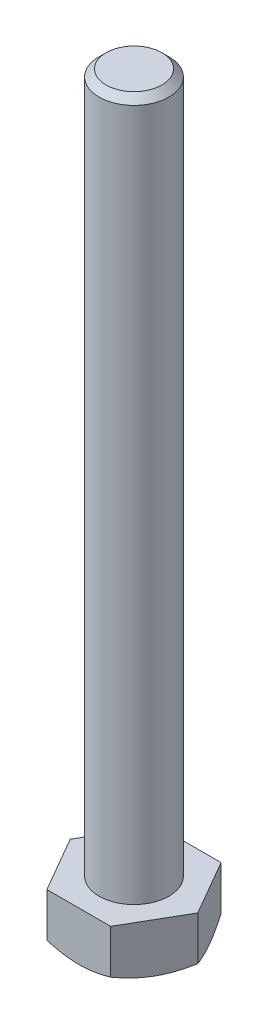
ISO-10303-21;
HEADER;
FILE_DESCRIPTION(('STEP AP214'),'2;1');
FILE_NAME('part.step','',(''),(''),'','','');
FILE_SCHEMA(('AUTOMOTIVE_DESIGN { 1 0 10303 214 1 1 1 1 }'));
ENDSEC;
DATA;
#1=APPLICATION_CONTEXT('core data for automotive mechanical design processes');
#2=APPLICATION_PROTOCOL_DEFINITION('international standard','automotive_design',2000,#1);
#3=PRODUCT_CONTEXT('',#1,'mechanical');
#4=PRODUCT('Part','Part','',(#3));
#5=PRODUCT_RELATED_PRODUCT_CATEGORY('part','',(#4));
#6=PRODUCT_DEFINITION_FORMATION('','',#4);
#7=PRODUCT_DEFINITION_CONTEXT('part definition',#1,'design');
#8=PRODUCT_DEFINITION('design','',#6,#7);
#9=PRODUCT_DEFINITION_SHAPE('','',#8);
#10=(LENGTH_UNIT() NAMED_UNIT(*) SI_UNIT(.MILLI.,.METRE.));
#11=(NAMED_UNIT(*) PLANE_ANGLE_UNIT() SI_UNIT($,.RADIAN.));
#12=(NAMED_UNIT(*) SI_UNIT($,.STERADIAN.) SOLID_ANGLE_UNIT());
#13=UNCERTAINTY_MEASURE_WITH_UNIT(LENGTH_MEASURE(1.E-05),#10,'distance_accuracy_value','');
#14=(GEOMETRIC_REPRESENTATION_CONTEXT(3) GLOBAL_UNCERTAINTY_ASSIGNED_CONTEXT((#13)) GLOBAL_UNIT_ASSIGNED_CONTEXT((#10,
#11,#12)) REPRESENTATION_CONTEXT('',''));
#15=CARTESIAN_POINT('',(0.,0.,0.));
#16=DIRECTION('',(0.,0.,1.));
#17=DIRECTION('',(1.,0.,0.));
#18=AXIS2_PLACEMENT_3D('',#15,#16,#17);
#19=CARTESIAN_POINT('',(2.28053356329902,53.5,3.95));
#20=DIRECTION('',(-0.866025403784439,0.,-0.5));
#21=DIRECTION('',(-0.5,0.,0.866025403784439));
#22=AXIS2_PLACEMENT_3D('',#19,#20,#21);
#23=PLANE('',#22);
#24=DIRECTION('',(0.,-1.,0.));
#25=VECTOR('',#24,1.);
#26=CARTESIAN_POINT('',(2.28053356329902,53.5,3.95));
#27=LINE('',#26,#25);
#28=CARTESIAN_POINT('',(2.28053356329902,3.5,3.95));
#29=VERTEX_POINT('',#28);
#30=CARTESIAN_POINT('',(2.28053356329902,0.352799770034311,3.95));
#31=VERTEX_POINT('',#30);
#32=EDGE_CURVE('E196',#29,#31,#27,.T.);
#33=ORIENTED_EDGE('',*,*,#32,.T.);
#34=CARTESIAN_POINT('',(2.28041809324518,0.352866439232559,3.9502));
#35=CARTESIAN_POINT('',(2.38063568061467,0.29498466517833,3.77661804686408));
#36=CARTESIAN_POINT('',(2.48171834047415,0.242343384693469,3.60153774422325));
#37=CARTESIAN_POINT('',(2.68563399767937,0.15045769122082,3.24834546548501));
#38=CARTESIAN_POINT('',(2.78847061820894,0.111245783680884,3.07022721384912));
#39=CARTESIAN_POINT('',(2.99286939806646,0.0502069964662325,2.71619814213081));
#40=CARTESIAN_POINT('',(3.09440010889697,0.0279738669923628,2.54034179244378));
#41=CARTESIAN_POINT('',(3.2979392458968,0.00143257410152678,2.18780166583136));
#42=CARTESIAN_POINT('',(3.39994693229981,-0.0028975682651904,2.01111917021878));
#43=CARTESIAN_POINT('',(3.59055257085472,0.0061125958312302,1.68098052003257));
#44=CARTESIAN_POINT('',(3.67917906182971,0.0172406019947407,1.52747493476735));
#45=CARTESIAN_POINT('',(3.85585464520722,0.0525092384080949,1.22146384790063));
#46=CARTESIAN_POINT('',(3.94390312656325,0.0766619154689032,1.06895940466271));
#47=CARTESIAN_POINT('',(4.1209429556258,0.137041499215026,0.762317425763064));
#48=CARTESIAN_POINT('',(4.20991189711042,0.173524342732937,0.60821869881607));
#49=CARTESIAN_POINT('',(4.386522859466,0.256325958671651,0.302319538842572));
#50=CARTESIAN_POINT('',(4.47416714283355,0.302625276645222,0.150515187057013));
#51=CARTESIAN_POINT('',(4.56118259665188,0.35286643923256,-0.000199999999999486));
#52=B_SPLINE_CURVE_WITH_KNOTS('',3,(#34,#35,#36,#37,#38,#39,#40,#41,#42,#43,#44,#45,#46,#47,#48,
#49,#50,#51),.UNSPECIFIED.,.F.,.F.,(4,2,2,2,2,2,2,2,4),(0.,0.626122435414088,1.25374984683404,
1.86584388199859,2.47718624449848,3.00948555938868,3.54227805643855,4.08688849089222,
4.63042953105667),.UNSPECIFIED.);
#53=CARTESIAN_POINT('',(3.42080034494853,0.,1.975));
#54=VERTEX_POINT('',#53);
#55=EDGE_CURVE('E56',#31,#54,#52,.T.);
#56=ORIENTED_EDGE('',*,*,#55,.T.);
#57=CARTESIAN_POINT('',(4.56106712659804,0.352799770034312,0.));
#58=VERTEX_POINT('',#57);
#59=EDGE_CURVE('E177',#54,#58,#52,.T.);
#60=ORIENTED_EDGE('',*,*,#59,.T.);
#61=DIRECTION('',(0.,-1.,0.));
#62=VECTOR('',#61,1.);
#63=CARTESIAN_POINT('',(4.56106712659804,53.5,0.));
#64=LINE('',#63,#62);
#65=CARTESIAN_POINT('',(4.56106712659804,3.5,0.));
#66=VERTEX_POINT('',#65);
#67=EDGE_CURVE('E208',#66,#58,#64,.T.);
#68=ORIENTED_EDGE('',*,*,#67,.F.);
#69=DIRECTION('',(0.5,0.,-0.866025403784439));
#70=VECTOR('',#69,1.);
#71=CARTESIAN_POINT('',(2.28053356329902,3.5,3.95));
#72=LINE('',#71,#70);
#73=EDGE_CURVE('E194',#29,#66,#72,.T.);
#74=ORIENTED_EDGE('',*,*,#73,.F.);
#75=EDGE_LOOP('',(#33,#56,#60,#68,#74));
#76=FACE_BOUND('',#75,.T.);
#77=ADVANCED_FACE('F34',(#76),#23,.F.);
#78=CARTESIAN_POINT('',(4.56106712659804,53.5,0.));
#79=DIRECTION('',(-0.866025403784438,0.,0.5));
#80=DIRECTION('',(0.5,0.,0.866025403784439));
#81=AXIS2_PLACEMENT_3D('',#78,#79,#80);
#82=PLANE('',#81);
#83=ORIENTED_EDGE('',*,*,#67,.T.);
#84=CARTESIAN_POINT('',(4.56118259665188,0.35286643923256,0.000200000000000792));
#85=CARTESIAN_POINT('',(4.4609650092824,0.294984665178331,-0.173381953135922));
#86=CARTESIAN_POINT('',(4.35988234942291,0.24234338469347,-0.348462255776748));
#87=CARTESIAN_POINT('',(4.15596669221769,0.150457691220819,-0.701654534514986));
#88=CARTESIAN_POINT('',(4.05313007168813,0.111245783680884,-0.879772786150876));
#89=CARTESIAN_POINT('',(3.84873129183061,0.0502069964662322,-1.23380185786919));
#90=CARTESIAN_POINT('',(3.74720058100009,0.0279738669923626,-1.40965820755622));
#91=CARTESIAN_POINT('',(3.54366144400027,0.00143257410152646,-1.76219833416864));
#92=CARTESIAN_POINT('',(3.44165375759725,-0.002897568265191,-1.93888082978122));
#93=CARTESIAN_POINT('',(3.25104811904234,0.00611259583122921,-2.26901947996743));
#94=CARTESIAN_POINT('',(3.16242162806736,0.0172406019947396,-2.42252506523265));
#95=CARTESIAN_POINT('',(2.98574604468985,0.0525092384080937,-2.72853615209937));
#96=CARTESIAN_POINT('',(2.89769756333382,0.0766619154689019,-2.88104059533729));
#97=CARTESIAN_POINT('',(2.72065773427127,0.137041499215025,-3.18768257423694));
#98=CARTESIAN_POINT('',(2.63168879278664,0.173524342732935,-3.34178130118393));
#99=CARTESIAN_POINT('',(2.45507783043106,0.25632595867165,-3.64768046115743));
#100=CARTESIAN_POINT('',(2.36743354706351,0.302625276645221,-3.79948481294299));
#101=CARTESIAN_POINT('',(2.28041809324518,0.352866439232559,-3.9502));
#102=B_SPLINE_CURVE_WITH_KNOTS('',3,(#84,#85,#86,#87,#88,#89,#90,#91,#92,#93,#94,#95,#96,#97,
#98,#99,#100,#101),.UNSPECIFIED.,.F.,.F.,(4,2,2,2,2,2,2,2,4),(0.,0.626122435414089,
1.25374984683404,1.86584388199859,2.47718624449848,3.00948555938868,3.54227805643855,
4.08688849089222,4.63042953105668),.UNSPECIFIED.);
#103=CARTESIAN_POINT('',(3.42080034494853,0.,-1.975));
#104=VERTEX_POINT('',#103);
#105=EDGE_CURVE('E143',#58,#104,#102,.T.);
#106=ORIENTED_EDGE('',*,*,#105,.T.);
#107=CARTESIAN_POINT('',(2.28053356329902,0.352799770034311,-3.95));
#108=VERTEX_POINT('',#107);
#109=EDGE_CURVE('E125',#104,#108,#102,.T.);
#110=ORIENTED_EDGE('',*,*,#109,.T.);
#111=DIRECTION('',(0.,-1.,0.));
#112=VECTOR('',#111,1.);
#113=CARTESIAN_POINT('',(2.28053356329902,53.5,-3.95));
#114=LINE('',#113,#112);
#115=CARTESIAN_POINT('',(2.28053356329902,3.5,-3.95));
#116=VERTEX_POINT('',#115);
#117=EDGE_CURVE('E142',#116,#108,#114,.T.);
#118=ORIENTED_EDGE('',*,*,#117,.F.);
#119=DIRECTION('',(-0.5,0.,-0.866025403784439));
#120=VECTOR('',#119,1.);
#121=CARTESIAN_POINT('',(4.56106712659804,3.5,0.));
#122=LINE('',#121,#120);
#123=EDGE_CURVE('E192',#66,#116,#122,.T.);
#124=ORIENTED_EDGE('',*,*,#123,.F.);
#125=EDGE_LOOP('',(#83,#106,#110,#118,#124));
#126=FACE_BOUND('',#125,.T.);
#127=ADVANCED_FACE('F168',(#126),#82,.F.);
#128=CARTESIAN_POINT('',(2.28053356329902,53.5,-3.95));
#129=DIRECTION('',(0.,0.,1.));
#130=DIRECTION('',(1.,0.,0.));
#131=AXIS2_PLACEMENT_3D('',#128,#129,#130);
#132=PLANE('',#131);
#133=ORIENTED_EDGE('',*,*,#117,.T.);
#134=CARTESIAN_POINT('',(-6.10357758199648,1.91693231106891,-3.95));
#135=CARTESIAN_POINT('',(-5.93124296341037,1.83342413986499,-3.95));
#136=CARTESIAN_POINT('',(-5.75851034716177,1.7507231237423,-3.95));
#137=CARTESIAN_POINT('',(-5.41203738808505,1.58738980517233,-3.95));
#138=CARTESIAN_POINT('',(-5.23829688964106,1.50675783320087,-3.95));
#139=CARTESIAN_POINT('',(-4.88869053692414,1.34760657001449,-3.95));
#140=CARTESIAN_POINT('',(-4.71281824674957,1.26910136723712,-3.95));
#141=CARTESIAN_POINT('',(-4.35966706590354,1.11533340183023,-3.95));
#142=CARTESIAN_POINT('',(-4.18238824282438,1.04007048449381,-3.95));
#143=CARTESIAN_POINT('',(-3.82050032721837,0.89132492021823,-3.95));
#144=CARTESIAN_POINT('',(-3.63583679895024,0.817973982970938,-3.95));
#145=CARTESIAN_POINT('',(-3.26434104766608,0.676877601703548,-3.95));
#146=CARTESIAN_POINT('',(-3.07750858274522,0.60913278992708,-3.95));
#147=CARTESIAN_POINT('',(-2.70173475211593,0.481043410509852,-3.95));
#148=CARTESIAN_POINT('',(-2.51279861234366,0.420683666781782,-3.95));
#149=CARTESIAN_POINT('',(-2.13221628603157,0.309315998631552,-3.95));
#150=CARTESIAN_POINT('',(-1.9405709808664,0.258305104875555,-3.95));
#151=CARTESIAN_POINT('',(-1.55552434463117,0.168368778188127,-3.95));
#152=CARTESIAN_POINT('',(-1.36213845471526,0.129378460835559,-3.95));
#153=CARTESIAN_POINT('',(-0.972985101602572,0.0657013823696122,-3.95));
#154=CARTESIAN_POINT('',(-0.777217857929892,0.0410133128601275,-3.95));
#155=CARTESIAN_POINT('',(-0.386827068328998,0.00823383358748254,-3.95));
#156=CARTESIAN_POINT('',(-0.192221734876161,-6.91438180813361E-05,-3.95));
#157=CARTESIAN_POINT('',(0.196997929016572,6.99774314488553E-05,-3.95));
#158=CARTESIAN_POINT('',(0.391612259559857,0.00851243380211182,-3.95));
#159=CARTESIAN_POINT('',(0.722677109724479,0.0365237749212534,-3.95));
#160=CARTESIAN_POINT('',(0.859484148618515,0.0521141661874182,-3.95));
#161=CARTESIAN_POINT('',(1.13207609093672,0.0905871323117199,-3.95));
#162=CARTESIAN_POINT('',(1.26786085001275,0.113470717925195,-3.95));
#163=CARTESIAN_POINT('',(1.67351297163642,0.191856311837088,-3.95));
#164=CARTESIAN_POINT('',(1.94152194628906,0.257078202966896,-3.95));
#165=CARTESIAN_POINT('',(2.34222812581931,0.369908571745236,-3.95));
#166=CARTESIAN_POINT('',(2.47700932246483,0.410535217395792,-3.95));
#167=CARTESIAN_POINT('',(2.74526197374985,0.49594181803233,-3.95));
#168=CARTESIAN_POINT('',(2.87873341992142,0.540721799851382,-3.95));
#169=CARTESIAN_POINT('',(3.1444100594592,0.633722017418443,-3.95));
#170=CARTESIAN_POINT('',(3.27661566965515,0.68194107318557,-3.95));
#171=CARTESIAN_POINT('',(3.53993613663676,0.781258796495595,-3.95));
#172=CARTESIAN_POINT('',(3.67105100463013,0.83235743440785,-3.95));
#173=CARTESIAN_POINT('',(3.97386714290639,0.95359226728304,-3.95));
#174=CARTESIAN_POINT('',(4.1452130929492,1.02461418324626,-3.95));
#175=CARTESIAN_POINT('',(4.48649853133974,1.16996930194956,-3.95));
#176=CARTESIAN_POINT('',(4.65643794353951,1.2443026825951,-3.95));
#177=CARTESIAN_POINT('',(4.99516077724692,1.3956337735108,-3.95));
#178=CARTESIAN_POINT('',(5.16394398064623,1.47263197074913,-3.95));
#179=CARTESIAN_POINT('',(5.50051447925895,1.62877818362153,-3.95));
#180=CARTESIAN_POINT('',(5.66830175446394,1.70792624226988,-3.95));
#181=CARTESIAN_POINT('',(6.17072112904776,1.94813182359853,-3.95));
#182=CARTESIAN_POINT('',(6.50409969730983,2.11180990992146,-3.95));
#183=CARTESIAN_POINT('',(7.16846869153804,2.44394123801235,-3.95));
#184=CARTESIAN_POINT('',(7.49945903325812,2.61239464720944,-3.95));
#185=CARTESIAN_POINT('',(8.13304098864775,2.93898775889549,-3.95));
#186=CARTESIAN_POINT('',(8.4357691875192,3.09686298206285,-3.95));
#187=CARTESIAN_POINT('',(9.04008916358199,3.41479351154543,-3.95));
#188=CARTESIAN_POINT('',(9.34168090395802,3.57484888772418,-3.95));
#189=CARTESIAN_POINT('',(9.9432653473041,3.8962513165353,-3.95));
#190=CARTESIAN_POINT('',(10.243260141572,4.05759445986514,-3.95));
#191=CARTESIAN_POINT('',(10.8425188719185,4.38159580299575,-3.95));
#192=CARTESIAN_POINT('',(11.1417828452411,4.5442539338812,-3.95));
#193=CARTESIAN_POINT('',(11.4407759086026,4.70740493554459,-3.95));
#194=B_SPLINE_CURVE_WITH_KNOTS('',3,(#134,#135,#136,#137,#138,#139,#140,#141,#142,#143,#144,
#145,#146,#147,#148,#149,#150,#151,#152,#153,#154,#155,#156,#157,#158,#159,#160,#161,#162,#163,
#164,#165,#166,#167,#168,#169,#170,#171,#172,#173,#174,#175,#176,#177,#178,#179,#180,#181,#182,
#183,#184,#185,#186,#187,#188,#189,#190,#191,#192,#193),.UNSPECIFIED.,.F.,.F.,(4,2,2,2,2,2,2,2,
2,2,2,2,2,2,2,2,2,2,2,2,2,2,2,2,2,2,2,2,2,4),(0.,0.574511714877499,1.14911462891598,
1.72688352304033,2.3046248180952,2.90064911574734,3.49674054005759,4.09158567320565,
4.68624154602117,5.27762900624728,5.86896235670716,6.45260899073125,7.03626809273551,
7.44914484842698,7.86207884912884,8.68841555975474,9.11069388963043,9.53297494787033,
9.95511180785677,10.3772443248853,10.9336439344889,11.4900734722945,12.0466052344872,
12.6031481399434,13.7172581519158,14.8314072744837,15.8556614473226,16.8799485202109,
17.9018335532885,18.9236653746146),.UNSPECIFIED.);
#195=CARTESIAN_POINT('',(0.,0.,-3.95));
#196=VERTEX_POINT('',#195);
#197=EDGE_CURVE('E118',#108,#196,#194,.F.);
#198=ORIENTED_EDGE('',*,*,#197,.T.);
#199=CARTESIAN_POINT('',(-2.28053356329902,0.352799770034311,-3.95));
#200=VERTEX_POINT('',#199);
#201=EDGE_CURVE('E106',#196,#200,#194,.F.);
#202=ORIENTED_EDGE('',*,*,#201,.T.);
#203=DIRECTION('',(0.,-1.,0.));
#204=VECTOR('',#203,1.);
#205=CARTESIAN_POINT('',(-2.28053356329902,53.5,-3.95));
#206=LINE('',#205,#204);
#207=CARTESIAN_POINT('',(-2.28053356329902,3.5,-3.95));
#208=VERTEX_POINT('',#207);
#209=EDGE_CURVE('E205',#208,#200,#206,.T.);
#210=ORIENTED_EDGE('',*,*,#209,.F.);
#211=DIRECTION('',(-1.,0.,0.));
#212=VECTOR('',#211,1.);
#213=CARTESIAN_POINT('',(2.28053356329902,3.5,-3.95));
#214=LINE('',#213,#212);
#215=EDGE_CURVE('E190',#116,#208,#214,.T.);
#216=ORIENTED_EDGE('',*,*,#215,.F.);
#217=EDGE_LOOP('',(#133,#198,#202,#210,#216));
#218=FACE_BOUND('',#217,.T.);
#219=ADVANCED_FACE('F139',(#218),#132,.F.);
#220=CARTESIAN_POINT('',(-2.28053356329902,53.5,-3.95));
#221=DIRECTION('',(0.866025403784439,0.,0.5));
#222=DIRECTION('',(0.5,0.,-0.866025403784439));
#223=AXIS2_PLACEMENT_3D('',#220,#221,#222);
#224=PLANE('',#223);
#225=ORIENTED_EDGE('',*,*,#209,.T.);
#226=CARTESIAN_POINT('',(-2.28041809324518,0.352866439232559,-3.9502));
#227=CARTESIAN_POINT('',(-2.38063568061467,0.29498466517833,-3.77661804686408));
#228=CARTESIAN_POINT('',(-2.48171834047415,0.242343384693469,-3.60153774422325));
#229=CARTESIAN_POINT('',(-2.68563399767937,0.15045769122082,-3.24834546548501));
#230=CARTESIAN_POINT('',(-2.78847061820894,0.111245783680884,-3.07022721384912));
#231=CARTESIAN_POINT('',(-2.99286939806646,0.0502069964662324,-2.71619814213081));
#232=CARTESIAN_POINT('',(-3.09440010889697,0.0279738669923625,-2.54034179244378));
#233=CARTESIAN_POINT('',(-3.29793924589679,0.00143257410152648,-2.18780166583136));
#234=CARTESIAN_POINT('',(-3.39994693229981,-0.00289756826519048,-2.01111917021878));
#235=CARTESIAN_POINT('',(-3.59055257085472,0.00611259583122976,-1.68098052003257));
#236=CARTESIAN_POINT('',(-3.67917906182971,0.0172406019947398,-1.52747493476735));
#237=CARTESIAN_POINT('',(-3.85585464520722,0.0525092384080938,-1.22146384790063));
#238=CARTESIAN_POINT('',(-3.94390312656325,0.0766619154689024,-1.06895940466271));
#239=CARTESIAN_POINT('',(-4.1209429556258,0.137041499215026,-0.762317425763064));
#240=CARTESIAN_POINT('',(-4.20991189711042,0.173524342732936,-0.60821869881607));
#241=CARTESIAN_POINT('',(-4.386522859466,0.256325958671651,-0.302319538842571));
#242=CARTESIAN_POINT('',(-4.47416714283355,0.302625276645221,-0.150515187057012));
#243=CARTESIAN_POINT('',(-4.56118259665188,0.352866439232559,0.000200000000000661));
#244=B_SPLINE_CURVE_WITH_KNOTS('',3,(#226,#227,#228,#229,#230,#231,#232,#233,#234,#235,#236,
#237,#238,#239,#240,#241,#242,#243),.UNSPECIFIED.,.F.,.F.,(4,2,2,2,2,2,2,2,4),(0.,
0.626122435414089,1.25374984683404,1.86584388199859,2.47718624449848,3.00948555938868,
3.54227805643855,4.08688849089222,4.63042953105668),.UNSPECIFIED.);
#245=CARTESIAN_POINT('',(-3.42080034494853,0.,-1.975));
#246=VERTEX_POINT('',#245);
#247=EDGE_CURVE('E113',#200,#246,#244,.T.);
#248=ORIENTED_EDGE('',*,*,#247,.T.);
#249=CARTESIAN_POINT('',(-4.56106712659804,0.352799770034311,0.));
#250=VERTEX_POINT('',#249);
#251=EDGE_CURVE('E151',#246,#250,#244,.T.);
#252=ORIENTED_EDGE('',*,*,#251,.T.);
#253=DIRECTION('',(0.,-1.,0.));
#254=VECTOR('',#253,1.);
#255=CARTESIAN_POINT('',(-4.56106712659804,53.5,0.));
#256=LINE('',#255,#254);
#257=CARTESIAN_POINT('',(-4.56106712659804,3.5,0.));
#258=VERTEX_POINT('',#257);
#259=EDGE_CURVE('E202',#258,#250,#256,.T.);
#260=ORIENTED_EDGE('',*,*,#259,.F.);
#261=DIRECTION('',(-0.5,0.,0.866025403784439));
#262=VECTOR('',#261,1.);
#263=CARTESIAN_POINT('',(-2.28053356329902,3.5,-3.95));
#264=LINE('',#263,#262);
#265=EDGE_CURVE('E188',#208,#258,#264,.T.);
#266=ORIENTED_EDGE('',*,*,#265,.F.);
#267=EDGE_LOOP('',(#225,#248,#252,#260,#266));
#268=FACE_BOUND('',#267,.T.);
#269=ADVANCED_FACE('F167',(#268),#224,.F.);
#270=CARTESIAN_POINT('',(-4.56106712659804,53.5,0.));
#271=DIRECTION('',(0.866025403784439,0.,-0.5));
#272=DIRECTION('',(-0.5,0.,-0.866025403784439));
#273=AXIS2_PLACEMENT_3D('',#270,#271,#272);
#274=PLANE('',#273);
#275=ORIENTED_EDGE('',*,*,#259,.T.);
#276=CARTESIAN_POINT('',(-4.56118259665188,0.352866439232559,-0.000199999999999148));
#277=CARTESIAN_POINT('',(-4.4609650092824,0.29498466517833,0.173381953135924));
#278=CARTESIAN_POINT('',(-4.35988234942291,0.242343384693469,0.34846225577675));
#279=CARTESIAN_POINT('',(-4.15596669221769,0.15045769122082,0.701654534514988));
#280=CARTESIAN_POINT('',(-4.05313007168813,0.111245783680884,0.879772786150879));
#281=CARTESIAN_POINT('',(-3.8487312918306,0.0502069964662323,1.23380185786919));
#282=CARTESIAN_POINT('',(-3.74720058100009,0.0279738669923624,1.40965820755622));
#283=CARTESIAN_POINT('',(-3.54366144400027,0.0014325741015265,1.76219833416864));
#284=CARTESIAN_POINT('',(-3.44165375759725,-0.00289756826519031,1.93888082978122));
#285=CARTESIAN_POINT('',(-3.25104811904234,0.00611259583123015,2.26901947996743));
#286=CARTESIAN_POINT('',(-3.16242162806736,0.0172406019947403,2.42252506523265));
#287=CARTESIAN_POINT('',(-2.98574604468985,0.0525092384080944,2.72853615209937));
#288=CARTESIAN_POINT('',(-2.89769756333382,0.0766619154689029,2.8810405953373));
#289=CARTESIAN_POINT('',(-2.72065773427127,0.137041499215026,3.18768257423694));
#290=CARTESIAN_POINT('',(-2.63168879278664,0.173524342732936,3.34178130118393));
#291=CARTESIAN_POINT('',(-2.45507783043106,0.25632595867165,3.64768046115743));
#292=CARTESIAN_POINT('',(-2.36743354706351,0.30262527664522,3.79948481294299));
#293=CARTESIAN_POINT('',(-2.28041809324518,0.352866439232559,3.9502));
#294=B_SPLINE_CURVE_WITH_KNOTS('',3,(#276,#277,#278,#279,#280,#281,#282,#283,#284,#285,#286,
#287,#288,#289,#290,#291,#292,#293),.UNSPECIFIED.,.F.,.F.,(4,2,2,2,2,2,2,2,4),(0.,
0.62612243541409,1.25374984683404,1.86584388199859,2.47718624449848,3.00948555938868,
3.54227805643855,4.08688849089222,4.63042953105667),.UNSPECIFIED.);
#295=CARTESIAN_POINT('',(-3.42080034494853,0.,1.975));
#296=VERTEX_POINT('',#295);
#297=EDGE_CURVE('E220',#250,#296,#294,.T.);
#298=ORIENTED_EDGE('',*,*,#297,.T.);
#299=CARTESIAN_POINT('',(-2.28053356329983,0.352799770033768,3.95));
#300=VERTEX_POINT('',#299);
#301=EDGE_CURVE('E223',#296,#300,#294,.T.);
#302=ORIENTED_EDGE('',*,*,#301,.T.);
#303=DIRECTION('',(0.,-1.,0.));
#304=VECTOR('',#303,1.);
#305=CARTESIAN_POINT('',(-2.28053356329902,53.5,3.95));
#306=LINE('',#305,#304);
#307=CARTESIAN_POINT('',(-2.28053356329902,3.5,3.95));
#308=VERTEX_POINT('',#307);
#309=EDGE_CURVE('E199',#308,#300,#306,.T.);
#310=ORIENTED_EDGE('',*,*,#309,.F.);
#311=DIRECTION('',(0.5,0.,0.866025403784439));
#312=VECTOR('',#311,1.);
#313=CARTESIAN_POINT('',(-4.56106712659804,3.5,0.));
#314=LINE('',#313,#312);
#315=EDGE_CURVE('E186',#258,#308,#314,.T.);
#316=ORIENTED_EDGE('',*,*,#315,.F.);
#317=EDGE_LOOP('',(#275,#298,#302,#310,#316));
#318=FACE_BOUND('',#317,.T.);
#319=ADVANCED_FACE('F221',(#318),#274,.F.);
#320=CARTESIAN_POINT('',(-2.28053356329902,53.5,3.95));
#321=DIRECTION('',(0.,0.,-1.));
#322=DIRECTION('',(-1.,0.,0.));
#323=AXIS2_PLACEMENT_3D('',#320,#321,#322);
#324=PLANE('',#323);
#325=ORIENTED_EDGE('',*,*,#309,.T.);
#326=CARTESIAN_POINT('',(-6.10357758202227,1.91693231108141,3.95));
#327=CARTESIAN_POINT('',(-5.9312429634353,1.83342413987697,3.95));
#328=CARTESIAN_POINT('',(-5.75851034718583,1.75072312375375,3.95));
#329=CARTESIAN_POINT('',(-5.41203738810737,1.58738980518274,3.95));
#330=CARTESIAN_POINT('',(-5.23829688966251,1.50675783321076,3.95));
#331=CARTESIAN_POINT('',(-4.88869053694384,1.34760657002333,3.95));
#332=CARTESIAN_POINT('',(-4.71281824676839,1.26910136724545,3.95));
#333=CARTESIAN_POINT('',(-4.35966706592059,1.11533340183752,3.95));
#334=CARTESIAN_POINT('',(-4.18238824284054,1.04007048450059,3.95));
#335=CARTESIAN_POINT('',(-3.82050032723268,0.891324920223971,3.95));
#336=CARTESIAN_POINT('',(-3.6358367989636,0.817973982976156,3.95));
#337=CARTESIAN_POINT('',(-3.26434104767752,0.676877601707747,3.95));
#338=CARTESIAN_POINT('',(-3.07750858275568,0.609132789930784,3.95));
#339=CARTESIAN_POINT('',(-2.70173475212444,0.481043410512614,3.95));
#340=CARTESIAN_POINT('',(-2.51279861235118,0.420683666784097,3.95));
#341=CARTESIAN_POINT('',(-2.13221628603708,0.309315998633048,3.95));
#342=CARTESIAN_POINT('',(-1.9405709808709,0.258305104876681,3.95));
#343=CARTESIAN_POINT('',(-1.5555243446331,0.168368778188504,3.95));
#344=CARTESIAN_POINT('',(-1.36213845471563,0.12937846083559,3.95));
#345=CARTESIAN_POINT('',(-0.9729851015998,0.0657013823691887,3.95));
#346=CARTESIAN_POINT('',(-0.777217857925527,0.0410133128595953,3.95));
#347=CARTESIAN_POINT('',(-0.386827068321476,0.00823383358701458,3.95));
#348=CARTESIAN_POINT('',(-0.192221734867074,-6.91438183812688E-05,3.95));
#349=CARTESIAN_POINT('',(0.196997929028762,6.99774317547079E-05,3.95));
#350=CARTESIAN_POINT('',(0.391612259573586,0.00851243380285552,3.95));
#351=CARTESIAN_POINT('',(0.722677109740162,0.0365237749228761,3.95));
#352=CARTESIAN_POINT('',(0.859484148634632,0.0521141661893918,3.95));
#353=CARTESIAN_POINT('',(1.13207609095368,0.0905871323144141,3.95));
#354=CARTESIAN_POINT('',(1.26786085003013,0.113470717928259,3.95));
#355=CARTESIAN_POINT('',(1.67351297165502,0.191856311841269,3.95));
#356=CARTESIAN_POINT('',(1.94152194630844,0.257078202971833,3.95));
#357=CARTESIAN_POINT('',(2.34222812583986,0.369908571751288,3.95));
#358=CARTESIAN_POINT('',(2.47700932248578,0.410535217402219,3.95));
#359=CARTESIAN_POINT('',(2.7452619737716,0.495941818039494,3.95));
#360=CARTESIAN_POINT('',(2.87873341994356,0.54072179985891,3.95));
#361=CARTESIAN_POINT('',(3.14441005948213,0.633722017426687,3.95));
#362=CARTESIAN_POINT('',(3.27661566967847,0.681941073194165,3.95));
#363=CARTESIAN_POINT('',(3.53993613666086,0.781258796504881,3.95));
#364=CARTESIAN_POINT('',(3.67105100465462,0.832357434417475,3.95));
#365=CARTESIAN_POINT('',(3.97386714293116,0.953592267293187,3.95));
#366=CARTESIAN_POINT('',(4.14521309297386,1.02461418325657,3.95));
#367=CARTESIAN_POINT('',(4.4864985313642,1.16996930196016,3.95));
#368=CARTESIAN_POINT('',(4.65643794356387,1.24430268260582,3.95));
#369=CARTESIAN_POINT('',(4.9951607772711,1.39563377352175,3.95));
#370=CARTESIAN_POINT('',(5.16394398067032,1.47263197076018,3.95));
#371=CARTESIAN_POINT('',(5.50051447928288,1.62877818363276,3.95));
#372=CARTESIAN_POINT('',(5.6683017544878,1.70792624228118,3.95));
#373=CARTESIAN_POINT('',(6.17072112907139,1.94813182361004,3.95));
#374=CARTESIAN_POINT('',(6.50409969733332,2.11180990993306,3.95));
#375=CARTESIAN_POINT('',(7.16846869156128,2.44394123802411,3.95));
#376=CARTESIAN_POINT('',(7.49945903328123,2.61239464722125,3.95));
#377=CARTESIAN_POINT('',(8.13304098867073,2.93898775890743,3.95));
#378=CARTESIAN_POINT('',(8.43576918754216,3.09686298207485,3.95));
#379=CARTESIAN_POINT('',(9.04008916360492,3.41479351155756,3.95));
#380=CARTESIAN_POINT('',(9.34168090398093,3.57484888773637,3.95));
#381=CARTESIAN_POINT('',(9.94326534732702,3.8962513165476,3.95));
#382=CARTESIAN_POINT('',(10.2432601415949,4.05759445987749,3.95));
#383=CARTESIAN_POINT('',(10.8425188719414,4.38159580300819,3.95));
#384=CARTESIAN_POINT('',(11.141782845264,4.54425393389369,3.94999999999999));
#385=CARTESIAN_POINT('',(11.4407759086256,4.70740493555712,3.95));
#386=B_SPLINE_CURVE_WITH_KNOTS('',3,(#326,#327,#328,#329,#330,#331,#332,#333,#334,#335,#336,
#337,#338,#339,#340,#341,#342,#343,#344,#345,#346,#347,#348,#349,#350,#351,#352,#353,#354,#355,
#356,#357,#358,#359,#360,#361,#362,#363,#364,#365,#366,#367,#368,#369,#370,#371,#372,#373,#374,
#375,#376,#377,#378,#379,#380,#381,#382,#383,#384,#385),.UNSPECIFIED.,.F.,.F.,(4,2,2,2,2,2,2,2,
2,2,2,2,2,2,2,2,2,2,2,2,2,2,2,2,2,2,2,2,2,4),(0.,0.574511714880523,1.14911462892202,
1.72688352304944,2.30462481810736,2.90064911576274,3.49674054007624,4.09158567322752,
4.68624154604627,5.27762900627716,5.8689623567418,6.45260899077054,7.03626809277945,
7.44914484847233,7.8620788491756,8.68841555980432,9.11069388968148,9.53297494792285,
9.95511180791075,10.3772443249407,10.9336439345442,11.4900734723497,12.0466052345423,
12.6031481399984,13.7172581519706,14.8314072745382,15.8556614473771,16.8799485202656,
17.9018335533432,18.9236653746694),.UNSPECIFIED.);
#387=CARTESIAN_POINT('',(0.,0.,3.95));
#388=VERTEX_POINT('',#387);
#389=EDGE_CURVE('E228',#300,#388,#386,.T.);
#390=ORIENTED_EDGE('',*,*,#389,.T.);
#391=EDGE_CURVE('E130',#388,#31,#386,.T.);
#392=ORIENTED_EDGE('',*,*,#391,.T.);
#393=ORIENTED_EDGE('',*,*,#32,.F.);
#394=DIRECTION('',(1.,0.,0.));
#395=VECTOR('',#394,1.);
#396=CARTESIAN_POINT('',(-2.28053356329902,3.5,3.95));
#397=LINE('',#396,#395);
#398=EDGE_CURVE('E211',#308,#29,#397,.T.);
#399=ORIENTED_EDGE('',*,*,#398,.F.);
#400=EDGE_LOOP('',(#325,#390,#392,#393,#399));
#401=FACE_BOUND('',#400,.T.);
#402=ADVANCED_FACE('F239',(#401),#324,.F.);
#403=CARTESIAN_POINT('',(0.,3.5,0.));
#404=DIRECTION('',(0.,1.,0.));
#405=DIRECTION('',(0.,0.,1.));
#406=AXIS2_PLACEMENT_3D('',#403,#404,#405);
#407=PLANE('',#406);
#408=CARTESIAN_POINT('',(0.,3.5,0.));
#409=DIRECTION('',(0.,1.,0.));
#410=DIRECTION('',(0.,0.,1.));
#411=AXIS2_PLACEMENT_3D('',#408,#409,#410);
#412=CIRCLE('',#411,2.5);
#413=CARTESIAN_POINT('',(0.,3.5,2.5));
#414=VERTEX_POINT('',#413);
#415=EDGE_CURVE('E183',#414,#414,#412,.T.);
#416=ORIENTED_EDGE('',*,*,#415,.F.);
#417=EDGE_LOOP('',(#416));
#418=FACE_BOUND('',#417,.T.);
#419=ORIENTED_EDGE('',*,*,#73,.T.);
#420=ORIENTED_EDGE('',*,*,#123,.T.);
#421=ORIENTED_EDGE('',*,*,#215,.T.);
#422=ORIENTED_EDGE('',*,*,#265,.T.);
#423=ORIENTED_EDGE('',*,*,#315,.T.);
#424=ORIENTED_EDGE('',*,*,#398,.T.);
#425=EDGE_LOOP('',(#419,#420,#421,#422,#423,#424));
#426=FACE_BOUND('',#425,.T.);
#427=ADVANCED_FACE('F243',(#418,#426),#407,.T.);
#428=CARTESIAN_POINT('',(0.,3.5,0.));
#429=DIRECTION('',(0.,1.,0.));
#430=DIRECTION('',(0.,0.,1.));
#431=AXIS2_PLACEMENT_3D('',#428,#429,#430);
#432=CYLINDRICAL_SURFACE('',#431,2.5);
#433=CARTESIAN_POINT('',(0.,53.,0.));
#434=DIRECTION('',(0.,1.,0.));
#435=DIRECTION('',(0.,0.,1.));
#436=AXIS2_PLACEMENT_3D('',#433,#434,#435);
#437=CIRCLE('',#436,2.5);
#438=CARTESIAN_POINT('',(0.,53.,2.5));
#439=VERTEX_POINT('',#438);
#440=EDGE_CURVE('E12',#439,#439,#437,.F.);
#441=ORIENTED_EDGE('',*,*,#440,.T.);
#442=EDGE_LOOP('',(#441));
#443=FACE_BOUND('',#442,.T.);
#444=ORIENTED_EDGE('',*,*,#415,.T.);
#445=EDGE_LOOP('',(#444));
#446=FACE_BOUND('',#445,.T.);
#447=ADVANCED_FACE('F251',(#443,#446),#432,.T.);
#448=CARTESIAN_POINT('',(0.,53.5,0.));
#449=DIRECTION('',(0.,1.,0.));
#450=DIRECTION('',(0.,0.,1.));
#451=AXIS2_PLACEMENT_3D('',#448,#449,#450);
#452=PLANE('',#451);
#453=CARTESIAN_POINT('',(0.,53.5,0.));
#454=DIRECTION('',(0.,1.,0.));
#455=DIRECTION('',(0.,0.,1.));
#456=AXIS2_PLACEMENT_3D('',#453,#454,#455);
#457=CIRCLE('',#456,1.99999999999999);
#458=CARTESIAN_POINT('',(0.,53.5,1.99999999999999));
#459=VERTEX_POINT('',#458);
#460=EDGE_CURVE('E42',#459,#459,#457,.T.);
#461=ORIENTED_EDGE('',*,*,#460,.T.);
#462=EDGE_LOOP('',(#461));
#463=FACE_BOUND('',#462,.T.);
#464=ADVANCED_FACE('F248',(#463),#452,.T.);
#465=CARTESIAN_POINT('',(0.,0.75,0.));
#466=DIRECTION('',(0.,1.,0.));
#467=DIRECTION('',(0.,0.,1.));
#468=AXIS2_PLACEMENT_3D('',#465,#466,#467);
#469=CONICAL_SURFACE('',#468,5.24903810567666,1.0471975511966);
#470=ORIENTED_EDGE('',*,*,#391,.F.);
#471=CARTESIAN_POINT('',(0.,0.,0.));
#472=DIRECTION('',(0.,1.,0.));
#473=DIRECTION('',(0.,0.,1.));
#474=AXIS2_PLACEMENT_3D('',#471,#472,#473);
#475=CIRCLE('',#474,3.95);
#476=EDGE_CURVE('E212',#54,#388,#475,.F.);
#477=ORIENTED_EDGE('',*,*,#476,.F.);
#478=ORIENTED_EDGE('',*,*,#55,.F.);
#479=EDGE_LOOP('',(#470,#477,#478));
#480=FACE_BOUND('',#479,.T.);
#481=ADVANCED_FACE('F162',(#480),#469,.T.);
#482=EDGE_CURVE('E136',#104,#54,#475,.F.);
#483=ORIENTED_EDGE('',*,*,#482,.F.);
#484=ORIENTED_EDGE('',*,*,#105,.F.);
#485=ORIENTED_EDGE('',*,*,#59,.F.);
#486=EDGE_LOOP('',(#483,#484,#485));
#487=FACE_BOUND('',#486,.T.);
#488=ADVANCED_FACE('F268',(#487),#469,.T.);
#489=CARTESIAN_POINT('',(0.,0.,0.));
#490=DIRECTION('',(0.,-1.,0.));
#491=DIRECTION('',(0.,0.,-1.));
#492=AXIS2_PLACEMENT_3D('',#489,#490,#491);
#493=CIRCLE('',#492,3.95);
#494=EDGE_CURVE('E122',#196,#104,#493,.T.);
#495=ORIENTED_EDGE('',*,*,#494,.F.);
#496=ORIENTED_EDGE('',*,*,#197,.F.);
#497=ORIENTED_EDGE('',*,*,#109,.F.);
#498=EDGE_LOOP('',(#495,#496,#497));
#499=FACE_BOUND('',#498,.T.);
#500=ADVANCED_FACE('F123',(#499),#469,.T.);
#501=EDGE_CURVE('E110',#246,#196,#475,.F.);
#502=ORIENTED_EDGE('',*,*,#501,.F.);
#503=ORIENTED_EDGE('',*,*,#247,.F.);
#504=ORIENTED_EDGE('',*,*,#201,.F.);
#505=EDGE_LOOP('',(#502,#503,#504));
#506=FACE_BOUND('',#505,.T.);
#507=ADVANCED_FACE('F108',(#506),#469,.T.);
#508=EDGE_CURVE('E135',#296,#246,#475,.F.);
#509=ORIENTED_EDGE('',*,*,#508,.F.);
#510=ORIENTED_EDGE('',*,*,#297,.F.);
#511=ORIENTED_EDGE('',*,*,#251,.F.);
#512=EDGE_LOOP('',(#509,#510,#511));
#513=FACE_BOUND('',#512,.T.);
#514=ADVANCED_FACE('F269',(#513),#469,.T.);
#515=EDGE_CURVE('E49',#388,#296,#475,.F.);
#516=ORIENTED_EDGE('',*,*,#515,.F.);
#517=ORIENTED_EDGE('',*,*,#389,.F.);
#518=ORIENTED_EDGE('',*,*,#301,.F.);
#519=EDGE_LOOP('',(#516,#517,#518));
#520=FACE_BOUND('',#519,.T.);
#521=ADVANCED_FACE('F247',(#520),#469,.T.);
#522=CARTESIAN_POINT('',(0.,0.,0.));
#523=DIRECTION('',(0.,1.,0.));
#524=DIRECTION('',(0.,0.,1.));
#525=AXIS2_PLACEMENT_3D('',#522,#523,#524);
#526=PLANE('',#525);
#527=ORIENTED_EDGE('',*,*,#476,.T.);
#528=ORIENTED_EDGE('',*,*,#515,.T.);
#529=ORIENTED_EDGE('',*,*,#508,.T.);
#530=ORIENTED_EDGE('',*,*,#501,.T.);
#531=ORIENTED_EDGE('',*,*,#494,.T.);
#532=ORIENTED_EDGE('',*,*,#482,.T.);
#533=EDGE_LOOP('',(#527,#528,#529,#530,#531,#532));
#534=FACE_BOUND('',#533,.T.);
#535=ADVANCED_FACE('F133',(#534),#526,.F.);
#536=CARTESIAN_POINT('',(0.,53.5,0.));
#537=DIRECTION('',(0.,-1.,0.));
#538=DIRECTION('',(0.,0.,-1.));
#539=AXIS2_PLACEMENT_3D('',#536,#537,#538);
#540=CONICAL_SURFACE('',#539,1.99999999999999,0.785398163397453);
#541=ORIENTED_EDGE('',*,*,#440,.F.);
#542=EDGE_LOOP('',(#541));
#543=FACE_BOUND('',#542,.T.);
#544=ORIENTED_EDGE('',*,*,#460,.F.);
#545=EDGE_LOOP('',(#544));
#546=FACE_BOUND('',#545,.T.);
#547=ADVANCED_FACE('F36',(#543,#546),#540,.T.);
#548=CLOSED_SHELL('',(#77,#127,#219,#269,#319,#402,#427,#447,#464,#481,#488,#500,#507,#514,#521,
#535,#547));
#549=MANIFOLD_SOLID_BREP('B2',#548);
#550=ADVANCED_BREP_SHAPE_REPRESENTATION('',(#18,#549),#14);
#551=SHAPE_DEFINITION_REPRESENTATION(#9,#550);
ENDSEC;
END-ISO-10303-21;
